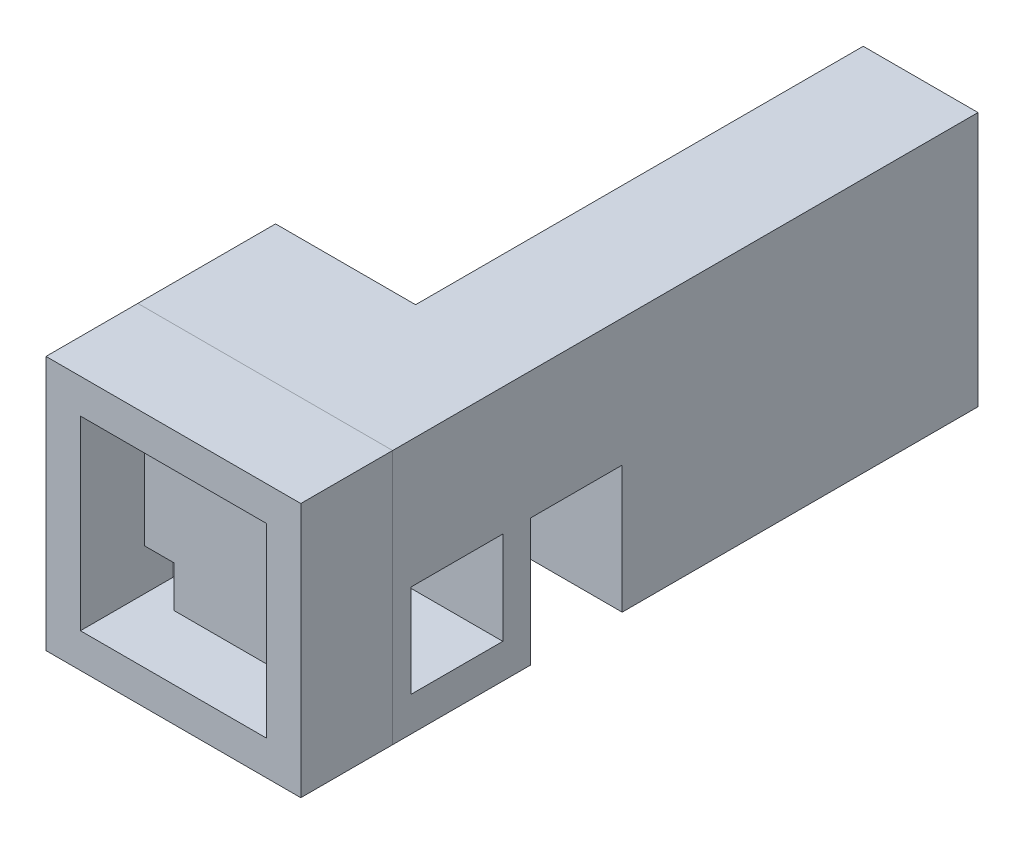
ISO-10303-21;
HEADER;
FILE_DESCRIPTION(('STEP AP214'),'2;1');
FILE_NAME('part.step','',(''),(''),'','','');
FILE_SCHEMA(('AUTOMOTIVE_DESIGN { 1 0 10303 214 1 1 1 1 }'));
ENDSEC;
DATA;
#1=APPLICATION_CONTEXT('core data for automotive mechanical design processes');
#2=APPLICATION_PROTOCOL_DEFINITION('international standard','automotive_design',2000,#1);
#3=PRODUCT_CONTEXT('',#1,'mechanical');
#4=PRODUCT('Part','Part','',(#3));
#5=PRODUCT_RELATED_PRODUCT_CATEGORY('part','',(#4));
#6=PRODUCT_DEFINITION_FORMATION('','',#4);
#7=PRODUCT_DEFINITION_CONTEXT('part definition',#1,'design');
#8=PRODUCT_DEFINITION('design','',#6,#7);
#9=PRODUCT_DEFINITION_SHAPE('','',#8);
#10=(LENGTH_UNIT() NAMED_UNIT(*) SI_UNIT(.MILLI.,.METRE.));
#11=(NAMED_UNIT(*) PLANE_ANGLE_UNIT() SI_UNIT($,.RADIAN.));
#12=(NAMED_UNIT(*) SI_UNIT($,.STERADIAN.) SOLID_ANGLE_UNIT());
#13=UNCERTAINTY_MEASURE_WITH_UNIT(LENGTH_MEASURE(1.E-05),#10,'distance_accuracy_value','');
#14=(GEOMETRIC_REPRESENTATION_CONTEXT(3) GLOBAL_UNCERTAINTY_ASSIGNED_CONTEXT((#13)) GLOBAL_UNIT_ASSIGNED_CONTEXT((#10,
#11,#12)) REPRESENTATION_CONTEXT('',''));
#15=CARTESIAN_POINT('',(0.,0.,0.));
#16=DIRECTION('',(0.,0.,1.));
#17=DIRECTION('',(1.,0.,0.));
#18=AXIS2_PLACEMENT_3D('',#15,#16,#17);
#19=CARTESIAN_POINT('',(8.1,8.1,25.5));
#20=DIRECTION('',(0.,0.,-1.));
#21=DIRECTION('',(-1.,0.,0.));
#22=AXIS2_PLACEMENT_3D('',#19,#20,#21);
#23=PLANE('',#22);
#24=DIRECTION('',(1.,0.,0.));
#25=VECTOR('',#24,1.);
#26=CARTESIAN_POINT('',(0.,0.,25.5));
#27=LINE('',#26,#25);
#28=CARTESIAN_POINT('',(0.,0.,25.5));
#29=VERTEX_POINT('',#28);
#30=CARTESIAN_POINT('',(1.275,0.,25.5));
#31=VERTEX_POINT('',#30);
#32=EDGE_CURVE('E225',#29,#31,#27,.T.);
#33=ORIENTED_EDGE('',*,*,#32,.T.);
#34=DIRECTION('',(0.,1.,0.));
#35=VECTOR('',#34,1.);
#36=CARTESIAN_POINT('',(1.275,0.,25.5));
#37=LINE('',#36,#35);
#38=CARTESIAN_POINT('',(1.275,1.8,25.5));
#39=VERTEX_POINT('',#38);
#40=EDGE_CURVE('E212',#31,#39,#37,.T.);
#41=ORIENTED_EDGE('',*,*,#40,.T.);
#42=DIRECTION('',(-1.,0.,0.));
#43=VECTOR('',#42,1.);
#44=CARTESIAN_POINT('',(0.,1.8,25.5));
#45=LINE('',#44,#43);
#46=CARTESIAN_POINT('',(0.,1.8,25.5));
#47=VERTEX_POINT('',#46);
#48=EDGE_CURVE('E240',#39,#47,#45,.T.);
#49=ORIENTED_EDGE('',*,*,#48,.T.);
#50=DIRECTION('',(0.,-1.,0.));
#51=VECTOR('',#50,1.);
#52=CARTESIAN_POINT('',(0.,0.,25.5));
#53=LINE('',#52,#51);
#54=EDGE_CURVE('E230',#47,#29,#53,.T.);
#55=ORIENTED_EDGE('',*,*,#54,.T.);
#56=EDGE_LOOP('',(#33,#41,#49,#55));
#57=FACE_BOUND('',#56,.T.);
#58=DIRECTION('',(-1.,0.,0.));
#59=VECTOR('',#58,1.);
#60=CARTESIAN_POINT('',(8.1,1.8,25.5));
#61=LINE('',#60,#59);
#62=CARTESIAN_POINT('',(8.1,1.8,25.5));
#63=VERTEX_POINT('',#62);
#64=CARTESIAN_POINT('',(6.825,1.8,25.5));
#65=VERTEX_POINT('',#64);
#66=EDGE_CURVE('E247',#63,#65,#61,.T.);
#67=ORIENTED_EDGE('',*,*,#66,.T.);
#68=DIRECTION('',(0.,-1.,0.));
#69=VECTOR('',#68,1.);
#70=CARTESIAN_POINT('',(6.825,0.,25.5));
#71=LINE('',#70,#69);
#72=CARTESIAN_POINT('',(6.825,0.,25.5));
#73=VERTEX_POINT('',#72);
#74=EDGE_CURVE('E261',#65,#73,#71,.T.);
#75=ORIENTED_EDGE('',*,*,#74,.T.);
#76=DIRECTION('',(1.,0.,0.));
#77=VECTOR('',#76,1.);
#78=CARTESIAN_POINT('',(8.1,0.,25.5));
#79=LINE('',#78,#77);
#80=CARTESIAN_POINT('',(8.1,0.,25.5));
#81=VERTEX_POINT('',#80);
#82=EDGE_CURVE('E257',#73,#81,#79,.T.);
#83=ORIENTED_EDGE('',*,*,#82,.T.);
#84=DIRECTION('',(0.,1.,0.));
#85=VECTOR('',#84,1.);
#86=CARTESIAN_POINT('',(8.1,0.,25.5));
#87=LINE('',#86,#85);
#88=EDGE_CURVE('E253',#81,#63,#87,.T.);
#89=ORIENTED_EDGE('',*,*,#88,.T.);
#90=EDGE_LOOP('',(#67,#75,#83,#89));
#91=FACE_BOUND('',#90,.T.);
#92=DIRECTION('',(1.,0.,0.));
#93=VECTOR('',#92,1.);
#94=CARTESIAN_POINT('',(0.,6.3,25.5));
#95=LINE('',#94,#93);
#96=CARTESIAN_POINT('',(0.,6.3,25.5));
#97=VERTEX_POINT('',#96);
#98=CARTESIAN_POINT('',(1.275,6.3,25.5));
#99=VERTEX_POINT('',#98);
#100=EDGE_CURVE('E270',#97,#99,#95,.T.);
#101=ORIENTED_EDGE('',*,*,#100,.T.);
#102=DIRECTION('',(0.,1.,0.));
#103=VECTOR('',#102,1.);
#104=CARTESIAN_POINT('',(1.275,8.1,25.5));
#105=LINE('',#104,#103);
#106=CARTESIAN_POINT('',(1.275,8.1,25.5));
#107=VERTEX_POINT('',#106);
#108=EDGE_CURVE('E284',#99,#107,#105,.T.);
#109=ORIENTED_EDGE('',*,*,#108,.T.);
#110=DIRECTION('',(-1.,0.,0.));
#111=VECTOR('',#110,1.);
#112=CARTESIAN_POINT('',(0.,8.1,25.5));
#113=LINE('',#112,#111);
#114=CARTESIAN_POINT('',(0.,8.1,25.5));
#115=VERTEX_POINT('',#114);
#116=EDGE_CURVE('E280',#107,#115,#113,.T.);
#117=ORIENTED_EDGE('',*,*,#116,.T.);
#118=DIRECTION('',(0.,-1.,0.));
#119=VECTOR('',#118,1.);
#120=CARTESIAN_POINT('',(0.,8.1,25.5));
#121=LINE('',#120,#119);
#122=EDGE_CURVE('E277',#115,#97,#121,.T.);
#123=ORIENTED_EDGE('',*,*,#122,.T.);
#124=EDGE_LOOP('',(#101,#109,#117,#123));
#125=FACE_BOUND('',#124,.T.);
#126=DIRECTION('',(1.,0.,0.));
#127=VECTOR('',#126,1.);
#128=CARTESIAN_POINT('',(8.1,6.3,25.5));
#129=LINE('',#128,#127);
#130=CARTESIAN_POINT('',(6.825,6.3,25.5));
#131=VERTEX_POINT('',#130);
#132=CARTESIAN_POINT('',(8.1,6.3,25.5));
#133=VERTEX_POINT('',#132);
#134=EDGE_CURVE('E294',#131,#133,#129,.T.);
#135=ORIENTED_EDGE('',*,*,#134,.T.);
#136=DIRECTION('',(0.,1.,0.));
#137=VECTOR('',#136,1.);
#138=CARTESIAN_POINT('',(8.1,8.1,25.5));
#139=LINE('',#138,#137);
#140=CARTESIAN_POINT('',(8.1,8.1,25.5));
#141=VERTEX_POINT('',#140);
#142=EDGE_CURVE('E307',#133,#141,#139,.T.);
#143=ORIENTED_EDGE('',*,*,#142,.T.);
#144=DIRECTION('',(-1.,0.,0.));
#145=VECTOR('',#144,1.);
#146=CARTESIAN_POINT('',(8.1,8.1,25.5));
#147=LINE('',#146,#145);
#148=CARTESIAN_POINT('',(6.825,8.1,25.5));
#149=VERTEX_POINT('',#148);
#150=EDGE_CURVE('E304',#141,#149,#147,.T.);
#151=ORIENTED_EDGE('',*,*,#150,.T.);
#152=DIRECTION('',(0.,-1.,0.));
#153=VECTOR('',#152,1.);
#154=CARTESIAN_POINT('',(6.825,8.1,25.5));
#155=LINE('',#154,#153);
#156=EDGE_CURVE('E300',#149,#131,#155,.T.);
#157=ORIENTED_EDGE('',*,*,#156,.T.);
#158=EDGE_LOOP('',(#135,#143,#151,#157));
#159=FACE_BOUND('',#158,.T.);
#160=DIRECTION('',(0.,1.,0.));
#161=VECTOR('',#160,1.);
#162=CARTESIAN_POINT('',(9.6,0.,25.5));
#163=LINE('',#162,#161);
#164=CARTESIAN_POINT('',(9.6,-1.5,25.5));
#165=VERTEX_POINT('',#164);
#166=CARTESIAN_POINT('',(9.6,9.60000000000001,25.5));
#167=VERTEX_POINT('',#166);
#168=EDGE_CURVE('E351',#165,#167,#163,.T.);
#169=ORIENTED_EDGE('',*,*,#168,.F.);
#170=DIRECTION('',(-1.,0.,0.));
#171=VECTOR('',#170,1.);
#172=CARTESIAN_POINT('',(0.,-1.5,25.5));
#173=LINE('',#172,#171);
#174=CARTESIAN_POINT('',(-1.5,-1.5,25.5));
#175=VERTEX_POINT('',#174);
#176=EDGE_CURVE('E354',#165,#175,#173,.T.);
#177=ORIENTED_EDGE('',*,*,#176,.T.);
#178=DIRECTION('',(0.,1.,0.));
#179=VECTOR('',#178,1.);
#180=CARTESIAN_POINT('',(-1.5,0.,25.5));
#181=LINE('',#180,#179);
#182=CARTESIAN_POINT('',(-1.5,9.6,25.5));
#183=VERTEX_POINT('',#182);
#184=EDGE_CURVE('E238',#175,#183,#181,.T.);
#185=ORIENTED_EDGE('',*,*,#184,.T.);
#186=DIRECTION('',(-1.,0.,0.));
#187=VECTOR('',#186,1.);
#188=CARTESIAN_POINT('',(0.,9.6,25.5));
#189=LINE('',#188,#187);
#190=EDGE_CURVE('E318',#167,#183,#189,.T.);
#191=ORIENTED_EDGE('',*,*,#190,.F.);
#192=EDGE_LOOP('',(#169,#177,#185,#191));
#193=FACE_BOUND('',#192,.T.);
#194=ADVANCED_FACE('F73',(#57,#91,#125,#159,#193),#23,.T.);
#195=CARTESIAN_POINT('',(0.,-1.5,19.5));
#196=DIRECTION('',(0.,1.,0.));
#197=DIRECTION('',(0.,0.,1.));
#198=AXIS2_PLACEMENT_3D('',#195,#196,#197);
#199=PLANE('',#198);
#200=ORIENTED_EDGE('',*,*,#176,.F.);
#201=DIRECTION('',(0.,0.,-1.));
#202=VECTOR('',#201,1.);
#203=CARTESIAN_POINT('',(9.6,-1.5,19.5));
#204=LINE('',#203,#202);
#205=CARTESIAN_POINT('',(9.6,-1.5,29.5));
#206=VERTEX_POINT('',#205);
#207=EDGE_CURVE('E317',#206,#165,#204,.T.);
#208=ORIENTED_EDGE('',*,*,#207,.F.);
#209=DIRECTION('',(1.,0.,0.));
#210=VECTOR('',#209,1.);
#211=CARTESIAN_POINT('',(0.,-1.5,29.5));
#212=LINE('',#211,#210);
#213=CARTESIAN_POINT('',(-1.5,-1.5,29.5));
#214=VERTEX_POINT('',#213);
#215=EDGE_CURVE('E326',#214,#206,#212,.T.);
#216=ORIENTED_EDGE('',*,*,#215,.F.);
#217=DIRECTION('',(0.,0.,-1.));
#218=VECTOR('',#217,1.);
#219=CARTESIAN_POINT('',(-1.5,-1.5,20.7));
#220=LINE('',#219,#218);
#221=EDGE_CURVE('E329',#214,#175,#220,.T.);
#222=ORIENTED_EDGE('',*,*,#221,.T.);
#223=EDGE_LOOP('',(#200,#208,#216,#222));
#224=FACE_BOUND('',#223,.T.);
#225=ADVANCED_FACE('F428',(#224),#199,.F.);
#226=CARTESIAN_POINT('',(9.6,0.,19.5));
#227=DIRECTION('',(1.,0.,0.));
#228=DIRECTION('',(0.,1.,0.));
#229=AXIS2_PLACEMENT_3D('',#226,#227,#228);
#230=PLANE('',#229);
#231=ORIENTED_EDGE('',*,*,#207,.T.);
#232=ORIENTED_EDGE('',*,*,#168,.T.);
#233=DIRECTION('',(0.,0.,-1.));
#234=VECTOR('',#233,1.);
#235=CARTESIAN_POINT('',(9.6,9.60000000000001,19.5));
#236=LINE('',#235,#234);
#237=CARTESIAN_POINT('',(9.6,9.60000000000001,29.5));
#238=VERTEX_POINT('',#237);
#239=EDGE_CURVE('E361',#238,#167,#236,.T.);
#240=ORIENTED_EDGE('',*,*,#239,.F.);
#241=DIRECTION('',(0.,1.,0.));
#242=VECTOR('',#241,1.);
#243=CARTESIAN_POINT('',(9.6,0.,29.5));
#244=LINE('',#243,#242);
#245=EDGE_CURVE('E322',#206,#238,#244,.T.);
#246=ORIENTED_EDGE('',*,*,#245,.F.);
#247=EDGE_LOOP('',(#231,#232,#240,#246));
#248=FACE_BOUND('',#247,.T.);
#249=ADVANCED_FACE('F430',(#248),#230,.T.);
#250=CARTESIAN_POINT('',(0.,9.6,19.5));
#251=DIRECTION('',(0.,1.,0.));
#252=DIRECTION('',(-1.,0.,0.));
#253=AXIS2_PLACEMENT_3D('',#250,#251,#252);
#254=PLANE('',#253);
#255=ORIENTED_EDGE('',*,*,#239,.T.);
#256=ORIENTED_EDGE('',*,*,#190,.T.);
#257=DIRECTION('',(0.,0.,-1.));
#258=VECTOR('',#257,1.);
#259=CARTESIAN_POINT('',(-1.5,9.6,20.7));
#260=LINE('',#259,#258);
#261=CARTESIAN_POINT('',(-1.5,9.6,29.5));
#262=VERTEX_POINT('',#261);
#263=EDGE_CURVE('E364',#262,#183,#260,.T.);
#264=ORIENTED_EDGE('',*,*,#263,.F.);
#265=DIRECTION('',(1.,0.,0.));
#266=VECTOR('',#265,1.);
#267=CARTESIAN_POINT('',(0.,9.6,29.5));
#268=LINE('',#267,#266);
#269=EDGE_CURVE('E335',#262,#238,#268,.T.);
#270=ORIENTED_EDGE('',*,*,#269,.T.);
#271=EDGE_LOOP('',(#255,#256,#264,#270));
#272=FACE_BOUND('',#271,.T.);
#273=ADVANCED_FACE('F437',(#272),#254,.T.);
#274=CARTESIAN_POINT('',(-1.5,0.,20.7));
#275=DIRECTION('',(1.,0.,0.));
#276=DIRECTION('',(0.,1.,0.));
#277=AXIS2_PLACEMENT_3D('',#274,#275,#276);
#278=PLANE('',#277);
#279=ORIENTED_EDGE('',*,*,#184,.F.);
#280=ORIENTED_EDGE('',*,*,#221,.F.);
#281=DIRECTION('',(0.,-1.,0.));
#282=VECTOR('',#281,1.);
#283=CARTESIAN_POINT('',(-1.5,0.,29.5));
#284=LINE('',#283,#282);
#285=EDGE_CURVE('E339',#262,#214,#284,.T.);
#286=ORIENTED_EDGE('',*,*,#285,.F.);
#287=ORIENTED_EDGE('',*,*,#263,.T.);
#288=EDGE_LOOP('',(#279,#280,#286,#287));
#289=FACE_BOUND('',#288,.T.);
#290=ADVANCED_FACE('F444',(#289),#278,.F.);
#291=CARTESIAN_POINT('',(0.,8.1,55.1977705423414));
#292=DIRECTION('',(0.,-1.,0.));
#293=DIRECTION('',(0.,0.,-1.));
#294=AXIS2_PLACEMENT_3D('',#291,#292,#293);
#295=PLANE('',#294);
#296=DIRECTION('',(-1.,0.,0.));
#297=VECTOR('',#296,1.);
#298=CARTESIAN_POINT('',(0.,8.1,26.7));
#299=LINE('',#298,#297);
#300=CARTESIAN_POINT('',(6.825,8.1,26.7));
#301=VERTEX_POINT('',#300);
#302=CARTESIAN_POINT('',(1.275,8.1,26.7));
#303=VERTEX_POINT('',#302);
#304=EDGE_CURVE('E338',#301,#303,#299,.T.);
#305=ORIENTED_EDGE('',*,*,#304,.F.);
#306=DIRECTION('',(0.,0.,1.));
#307=VECTOR('',#306,1.);
#308=CARTESIAN_POINT('',(6.825,8.1,23.2941838245221));
#309=LINE('',#308,#307);
#310=EDGE_CURVE('E303',#149,#301,#309,.T.);
#311=ORIENTED_EDGE('',*,*,#310,.F.);
#312=ORIENTED_EDGE('',*,*,#150,.F.);
#313=DIRECTION('',(0.,0.,-1.));
#314=VECTOR('',#313,1.);
#315=CARTESIAN_POINT('',(8.1,8.1,55.1977705423414));
#316=LINE('',#315,#314);
#317=CARTESIAN_POINT('',(8.1,8.1,29.5));
#318=VERTEX_POINT('',#317);
#319=EDGE_CURVE('E342',#318,#141,#316,.T.);
#320=ORIENTED_EDGE('',*,*,#319,.F.);
#321=DIRECTION('',(-1.,0.,0.));
#322=VECTOR('',#321,1.);
#323=CARTESIAN_POINT('',(0.,8.1,29.5));
#324=LINE('',#323,#322);
#325=CARTESIAN_POINT('',(0.,8.1,29.5));
#326=VERTEX_POINT('',#325);
#327=EDGE_CURVE('E333',#318,#326,#324,.T.);
#328=ORIENTED_EDGE('',*,*,#327,.T.);
#329=DIRECTION('',(0.,0.,-1.));
#330=VECTOR('',#329,1.);
#331=CARTESIAN_POINT('',(0.,8.1,55.1977705423414));
#332=LINE('',#331,#330);
#333=EDGE_CURVE('E77',#326,#115,#332,.T.);
#334=ORIENTED_EDGE('',*,*,#333,.T.);
#335=ORIENTED_EDGE('',*,*,#116,.F.);
#336=DIRECTION('',(0.,0.,1.));
#337=VECTOR('',#336,1.);
#338=CARTESIAN_POINT('',(1.275,8.1,23.2941838245221));
#339=LINE('',#338,#337);
#340=EDGE_CURVE('E283',#107,#303,#339,.T.);
#341=ORIENTED_EDGE('',*,*,#340,.T.);
#342=EDGE_LOOP('',(#305,#311,#312,#320,#328,#334,#335,#341));
#343=FACE_BOUND('',#342,.T.);
#344=ADVANCED_FACE('F406',(#343),#295,.T.);
#345=CARTESIAN_POINT('',(0.,0.,55.1977705423414));
#346=DIRECTION('',(1.,0.,0.));
#347=DIRECTION('',(0.,1.,0.));
#348=AXIS2_PLACEMENT_3D('',#345,#346,#347);
#349=PLANE('',#348);
#350=DIRECTION('',(0.,-1.,0.));
#351=VECTOR('',#350,1.);
#352=CARTESIAN_POINT('',(0.,0.,26.7));
#353=LINE('',#352,#351);
#354=CARTESIAN_POINT('',(0.,6.3,26.7));
#355=VERTEX_POINT('',#354);
#356=CARTESIAN_POINT('',(0.,1.8,26.7));
#357=VERTEX_POINT('',#356);
#358=EDGE_CURVE('E82',#355,#357,#353,.T.);
#359=ORIENTED_EDGE('',*,*,#358,.F.);
#360=DIRECTION('',(0.,0.,1.));
#361=VECTOR('',#360,1.);
#362=CARTESIAN_POINT('',(0.,6.3,23.2941838245221));
#363=LINE('',#362,#361);
#364=EDGE_CURVE('E249',#97,#355,#363,.T.);
#365=ORIENTED_EDGE('',*,*,#364,.F.);
#366=ORIENTED_EDGE('',*,*,#122,.F.);
#367=ORIENTED_EDGE('',*,*,#333,.F.);
#368=DIRECTION('',(0.,-1.,0.));
#369=VECTOR('',#368,1.);
#370=CARTESIAN_POINT('',(0.,0.,29.5));
#371=LINE('',#370,#369);
#372=CARTESIAN_POINT('',(0.,0.,29.5));
#373=VERTEX_POINT('',#372);
#374=EDGE_CURVE('E330',#326,#373,#371,.T.);
#375=ORIENTED_EDGE('',*,*,#374,.T.);
#376=DIRECTION('',(0.,0.,-1.));
#377=VECTOR('',#376,1.);
#378=CARTESIAN_POINT('',(0.,0.,55.1977705423414));
#379=LINE('',#378,#377);
#380=EDGE_CURVE('E332',#373,#29,#379,.T.);
#381=ORIENTED_EDGE('',*,*,#380,.T.);
#382=ORIENTED_EDGE('',*,*,#54,.F.);
#383=DIRECTION('',(0.,0.,1.));
#384=VECTOR('',#383,1.);
#385=CARTESIAN_POINT('',(0.,1.8,23.2941838245221));
#386=LINE('',#385,#384);
#387=EDGE_CURVE('E239',#47,#357,#386,.T.);
#388=ORIENTED_EDGE('',*,*,#387,.T.);
#389=EDGE_LOOP('',(#359,#365,#366,#367,#375,#381,#382,#388));
#390=FACE_BOUND('',#389,.T.);
#391=ADVANCED_FACE('F75',(#390),#349,.T.);
#392=CARTESIAN_POINT('',(0.,0.,55.1977705423414));
#393=DIRECTION('',(0.,-1.,0.));
#394=DIRECTION('',(0.,0.,-1.));
#395=AXIS2_PLACEMENT_3D('',#392,#393,#394);
#396=PLANE('',#395);
#397=DIRECTION('',(0.,0.,-1.));
#398=VECTOR('',#397,1.);
#399=CARTESIAN_POINT('',(8.1,0.,55.1977705423414));
#400=LINE('',#399,#398);
#401=CARTESIAN_POINT('',(8.1,0.,29.5));
#402=VERTEX_POINT('',#401);
#403=EDGE_CURVE('E368',#402,#81,#400,.T.);
#404=ORIENTED_EDGE('',*,*,#403,.T.);
#405=ORIENTED_EDGE('',*,*,#82,.F.);
#406=DIRECTION('',(0.,0.,1.));
#407=VECTOR('',#406,1.);
#408=CARTESIAN_POINT('',(6.825,0.,23.2941838245221));
#409=LINE('',#408,#407);
#410=CARTESIAN_POINT('',(6.825,0.,26.7));
#411=VERTEX_POINT('',#410);
#412=EDGE_CURVE('E260',#73,#411,#409,.T.);
#413=ORIENTED_EDGE('',*,*,#412,.T.);
#414=DIRECTION('',(-1.,0.,0.));
#415=VECTOR('',#414,1.);
#416=CARTESIAN_POINT('',(0.,0.,26.7));
#417=LINE('',#416,#415);
#418=CARTESIAN_POINT('',(1.275,0.,26.7));
#419=VERTEX_POINT('',#418);
#420=EDGE_CURVE('E14',#411,#419,#417,.T.);
#421=ORIENTED_EDGE('',*,*,#420,.T.);
#422=DIRECTION('',(0.,0.,1.));
#423=VECTOR('',#422,1.);
#424=CARTESIAN_POINT('',(1.275,0.,23.2941838245221));
#425=LINE('',#424,#423);
#426=EDGE_CURVE('E215',#31,#419,#425,.T.);
#427=ORIENTED_EDGE('',*,*,#426,.F.);
#428=ORIENTED_EDGE('',*,*,#32,.F.);
#429=ORIENTED_EDGE('',*,*,#380,.F.);
#430=DIRECTION('',(-1.,0.,0.));
#431=VECTOR('',#430,1.);
#432=CARTESIAN_POINT('',(0.,0.,29.5));
#433=LINE('',#432,#431);
#434=EDGE_CURVE('E323',#402,#373,#433,.T.);
#435=ORIENTED_EDGE('',*,*,#434,.F.);
#436=EDGE_LOOP('',(#404,#405,#413,#421,#427,#428,#429,#435));
#437=FACE_BOUND('',#436,.T.);
#438=ADVANCED_FACE('F223',(#437),#396,.F.);
#439=CARTESIAN_POINT('',(8.1,0.,55.1977705423414));
#440=DIRECTION('',(1.,0.,0.));
#441=DIRECTION('',(0.,1.,0.));
#442=AXIS2_PLACEMENT_3D('',#439,#440,#441);
#443=PLANE('',#442);
#444=ORIENTED_EDGE('',*,*,#319,.T.);
#445=ORIENTED_EDGE('',*,*,#142,.F.);
#446=DIRECTION('',(0.,0.,1.));
#447=VECTOR('',#446,1.);
#448=CARTESIAN_POINT('',(8.1,6.3,23.2941838245221));
#449=LINE('',#448,#447);
#450=CARTESIAN_POINT('',(8.1,6.3,26.7));
#451=VERTEX_POINT('',#450);
#452=EDGE_CURVE('E299',#133,#451,#449,.T.);
#453=ORIENTED_EDGE('',*,*,#452,.T.);
#454=DIRECTION('',(0.,-1.,0.));
#455=VECTOR('',#454,1.);
#456=CARTESIAN_POINT('',(8.1,0.,26.7));
#457=LINE('',#456,#455);
#458=CARTESIAN_POINT('',(8.1,1.8,26.7));
#459=VERTEX_POINT('',#458);
#460=EDGE_CURVE('E314',#451,#459,#457,.T.);
#461=ORIENTED_EDGE('',*,*,#460,.T.);
#462=DIRECTION('',(0.,0.,1.));
#463=VECTOR('',#462,1.);
#464=CARTESIAN_POINT('',(8.1,1.8,23.2941838245221));
#465=LINE('',#464,#463);
#466=EDGE_CURVE('E256',#63,#459,#465,.T.);
#467=ORIENTED_EDGE('',*,*,#466,.F.);
#468=ORIENTED_EDGE('',*,*,#88,.F.);
#469=ORIENTED_EDGE('',*,*,#403,.F.);
#470=DIRECTION('',(0.,-1.,0.));
#471=VECTOR('',#470,1.);
#472=CARTESIAN_POINT('',(8.1,0.,29.5));
#473=LINE('',#472,#471);
#474=EDGE_CURVE('E319',#318,#402,#473,.T.);
#475=ORIENTED_EDGE('',*,*,#474,.F.);
#476=EDGE_LOOP('',(#444,#445,#453,#461,#467,#468,#469,#475));
#477=FACE_BOUND('',#476,.T.);
#478=ADVANCED_FACE('F380',(#477),#443,.F.);
#479=CARTESIAN_POINT('',(0.,0.,29.5));
#480=DIRECTION('',(0.,0.,1.));
#481=DIRECTION('',(1.,0.,0.));
#482=AXIS2_PLACEMENT_3D('',#479,#480,#481);
#483=PLANE('',#482);
#484=ORIENTED_EDGE('',*,*,#269,.F.);
#485=ORIENTED_EDGE('',*,*,#285,.T.);
#486=ORIENTED_EDGE('',*,*,#215,.T.);
#487=ORIENTED_EDGE('',*,*,#245,.T.);
#488=EDGE_LOOP('',(#484,#485,#486,#487));
#489=FACE_BOUND('',#488,.T.);
#490=ORIENTED_EDGE('',*,*,#327,.F.);
#491=ORIENTED_EDGE('',*,*,#474,.T.);
#492=ORIENTED_EDGE('',*,*,#434,.T.);
#493=ORIENTED_EDGE('',*,*,#374,.F.);
#494=EDGE_LOOP('',(#490,#491,#492,#493));
#495=FACE_BOUND('',#494,.T.);
#496=ADVANCED_FACE('F377',(#489,#495),#483,.T.);
#497=CARTESIAN_POINT('',(0.,0.,26.7));
#498=DIRECTION('',(0.,0.,1.));
#499=DIRECTION('',(1.,0.,0.));
#500=AXIS2_PLACEMENT_3D('',#497,#498,#499);
#501=PLANE('',#500);
#502=DIRECTION('',(0.,1.,0.));
#503=VECTOR('',#502,1.);
#504=CARTESIAN_POINT('',(1.275,0.,26.7));
#505=LINE('',#504,#503);
#506=CARTESIAN_POINT('',(1.275,1.8,26.7));
#507=VERTEX_POINT('',#506);
#508=EDGE_CURVE('E90',#419,#507,#505,.T.);
#509=ORIENTED_EDGE('',*,*,#508,.F.);
#510=ORIENTED_EDGE('',*,*,#420,.F.);
#511=DIRECTION('',(0.,-1.,0.));
#512=VECTOR('',#511,1.);
#513=CARTESIAN_POINT('',(6.825,0.,26.7));
#514=LINE('',#513,#512);
#515=CARTESIAN_POINT('',(6.825,1.8,26.7));
#516=VERTEX_POINT('',#515);
#517=EDGE_CURVE('E244',#516,#411,#514,.T.);
#518=ORIENTED_EDGE('',*,*,#517,.F.);
#519=DIRECTION('',(-1.,0.,0.));
#520=VECTOR('',#519,1.);
#521=CARTESIAN_POINT('',(8.1,1.8,26.7));
#522=LINE('',#521,#520);
#523=EDGE_CURVE('E98',#459,#516,#522,.T.);
#524=ORIENTED_EDGE('',*,*,#523,.F.);
#525=ORIENTED_EDGE('',*,*,#460,.F.);
#526=DIRECTION('',(1.,0.,0.));
#527=VECTOR('',#526,1.);
#528=CARTESIAN_POINT('',(8.1,6.3,26.7));
#529=LINE('',#528,#527);
#530=CARTESIAN_POINT('',(6.825,6.3,26.7));
#531=VERTEX_POINT('',#530);
#532=EDGE_CURVE('E291',#531,#451,#529,.T.);
#533=ORIENTED_EDGE('',*,*,#532,.F.);
#534=DIRECTION('',(0.,-1.,0.));
#535=VECTOR('',#534,1.);
#536=CARTESIAN_POINT('',(6.825,8.1,26.7));
#537=LINE('',#536,#535);
#538=EDGE_CURVE('E295',#301,#531,#537,.T.);
#539=ORIENTED_EDGE('',*,*,#538,.F.);
#540=ORIENTED_EDGE('',*,*,#304,.T.);
#541=DIRECTION('',(0.,1.,0.));
#542=VECTOR('',#541,1.);
#543=CARTESIAN_POINT('',(1.275,8.1,26.7));
#544=LINE('',#543,#542);
#545=CARTESIAN_POINT('',(1.275,6.3,26.7));
#546=VERTEX_POINT('',#545);
#547=EDGE_CURVE('E267',#546,#303,#544,.T.);
#548=ORIENTED_EDGE('',*,*,#547,.F.);
#549=DIRECTION('',(1.,0.,0.));
#550=VECTOR('',#549,1.);
#551=CARTESIAN_POINT('',(0.,6.3,26.7));
#552=LINE('',#551,#550);
#553=EDGE_CURVE('E271',#355,#546,#552,.T.);
#554=ORIENTED_EDGE('',*,*,#553,.F.);
#555=ORIENTED_EDGE('',*,*,#358,.T.);
#556=DIRECTION('',(-1.,0.,0.));
#557=VECTOR('',#556,1.);
#558=CARTESIAN_POINT('',(0.,1.8,26.7));
#559=LINE('',#558,#557);
#560=EDGE_CURVE('E231',#507,#357,#559,.T.);
#561=ORIENTED_EDGE('',*,*,#560,.F.);
#562=EDGE_LOOP('',(#509,#510,#518,#524,#525,#533,#539,#540,#548,#554,#555,#561));
#563=FACE_BOUND('',#562,.T.);
#564=ADVANCED_FACE('F391',(#563),#501,.T.);
#565=CARTESIAN_POINT('',(8.1,6.3,23.2941838245221));
#566=DIRECTION('',(0.,-1.,0.));
#567=DIRECTION('',(0.,0.,-1.));
#568=AXIS2_PLACEMENT_3D('',#565,#566,#567);
#569=PLANE('',#568);
#570=DIRECTION('',(0.,0.,1.));
#571=VECTOR('',#570,1.);
#572=CARTESIAN_POINT('',(6.825,6.3,23.2941838245221));
#573=LINE('',#572,#571);
#574=EDGE_CURVE('E273',#131,#531,#573,.T.);
#575=ORIENTED_EDGE('',*,*,#574,.T.);
#576=ORIENTED_EDGE('',*,*,#532,.T.);
#577=ORIENTED_EDGE('',*,*,#452,.F.);
#578=ORIENTED_EDGE('',*,*,#134,.F.);
#579=EDGE_LOOP('',(#575,#576,#577,#578));
#580=FACE_BOUND('',#579,.T.);
#581=ADVANCED_FACE('F418',(#580),#569,.F.);
#582=CARTESIAN_POINT('',(6.825,8.1,23.2941838245221));
#583=DIRECTION('',(-1.,0.,0.));
#584=DIRECTION('',(0.,0.,1.));
#585=AXIS2_PLACEMENT_3D('',#582,#583,#584);
#586=PLANE('',#585);
#587=ORIENTED_EDGE('',*,*,#310,.T.);
#588=ORIENTED_EDGE('',*,*,#538,.T.);
#589=ORIENTED_EDGE('',*,*,#574,.F.);
#590=ORIENTED_EDGE('',*,*,#156,.F.);
#591=EDGE_LOOP('',(#587,#588,#589,#590));
#592=FACE_BOUND('',#591,.T.);
#593=ADVANCED_FACE('F419',(#592),#586,.F.);
#594=CARTESIAN_POINT('',(0.,6.3,23.2941838245221));
#595=DIRECTION('',(0.,-1.,0.));
#596=DIRECTION('',(0.,0.,-1.));
#597=AXIS2_PLACEMENT_3D('',#594,#595,#596);
#598=PLANE('',#597);
#599=ORIENTED_EDGE('',*,*,#364,.T.);
#600=ORIENTED_EDGE('',*,*,#553,.T.);
#601=DIRECTION('',(0.,0.,1.));
#602=VECTOR('',#601,1.);
#603=CARTESIAN_POINT('',(1.275,6.3,23.2941838245221));
#604=LINE('',#603,#602);
#605=EDGE_CURVE('E276',#99,#546,#604,.T.);
#606=ORIENTED_EDGE('',*,*,#605,.F.);
#607=ORIENTED_EDGE('',*,*,#100,.F.);
#608=EDGE_LOOP('',(#599,#600,#606,#607));
#609=FACE_BOUND('',#608,.T.);
#610=ADVANCED_FACE('F401',(#609),#598,.F.);
#611=CARTESIAN_POINT('',(1.275,8.1,23.2941838245221));
#612=DIRECTION('',(1.,0.,0.));
#613=DIRECTION('',(0.,1.,0.));
#614=AXIS2_PLACEMENT_3D('',#611,#612,#613);
#615=PLANE('',#614);
#616=ORIENTED_EDGE('',*,*,#605,.T.);
#617=ORIENTED_EDGE('',*,*,#547,.T.);
#618=ORIENTED_EDGE('',*,*,#340,.F.);
#619=ORIENTED_EDGE('',*,*,#108,.F.);
#620=EDGE_LOOP('',(#616,#617,#618,#619));
#621=FACE_BOUND('',#620,.T.);
#622=ADVANCED_FACE('F408',(#621),#615,.F.);
#623=CARTESIAN_POINT('',(8.1,1.8,23.2941838245221));
#624=DIRECTION('',(0.,1.,0.));
#625=DIRECTION('',(-1.,0.,0.));
#626=AXIS2_PLACEMENT_3D('',#623,#624,#625);
#627=PLANE('',#626);
#628=ORIENTED_EDGE('',*,*,#466,.T.);
#629=ORIENTED_EDGE('',*,*,#523,.T.);
#630=DIRECTION('',(0.,0.,1.));
#631=VECTOR('',#630,1.);
#632=CARTESIAN_POINT('',(6.825,1.8,23.2941838245221));
#633=LINE('',#632,#631);
#634=EDGE_CURVE('E252',#65,#516,#633,.T.);
#635=ORIENTED_EDGE('',*,*,#634,.F.);
#636=ORIENTED_EDGE('',*,*,#66,.F.);
#637=EDGE_LOOP('',(#628,#629,#635,#636));
#638=FACE_BOUND('',#637,.T.);
#639=ADVANCED_FACE('F389',(#638),#627,.F.);
#640=CARTESIAN_POINT('',(6.825,0.,23.2941838245221));
#641=DIRECTION('',(-1.,0.,0.));
#642=DIRECTION('',(0.,0.,1.));
#643=AXIS2_PLACEMENT_3D('',#640,#641,#642);
#644=PLANE('',#643);
#645=ORIENTED_EDGE('',*,*,#634,.T.);
#646=ORIENTED_EDGE('',*,*,#517,.T.);
#647=ORIENTED_EDGE('',*,*,#412,.F.);
#648=ORIENTED_EDGE('',*,*,#74,.F.);
#649=EDGE_LOOP('',(#645,#646,#647,#648));
#650=FACE_BOUND('',#649,.T.);
#651=ADVANCED_FACE('F385',(#650),#644,.F.);
#652=CARTESIAN_POINT('',(1.275,0.,23.2941838245221));
#653=DIRECTION('',(1.,0.,0.));
#654=DIRECTION('',(0.,0.,-1.));
#655=AXIS2_PLACEMENT_3D('',#652,#653,#654);
#656=PLANE('',#655);
#657=ORIENTED_EDGE('',*,*,#426,.T.);
#658=ORIENTED_EDGE('',*,*,#508,.T.);
#659=DIRECTION('',(0.,0.,1.));
#660=VECTOR('',#659,1.);
#661=CARTESIAN_POINT('',(1.275,1.8,23.2941838245221));
#662=LINE('',#661,#660);
#663=EDGE_CURVE('E216',#39,#507,#662,.T.);
#664=ORIENTED_EDGE('',*,*,#663,.F.);
#665=ORIENTED_EDGE('',*,*,#40,.F.);
#666=EDGE_LOOP('',(#657,#658,#664,#665));
#667=FACE_BOUND('',#666,.T.);
#668=ADVANCED_FACE('F214',(#667),#656,.F.);
#669=CARTESIAN_POINT('',(0.,1.8,23.2941838245221));
#670=DIRECTION('',(0.,1.,0.));
#671=DIRECTION('',(0.,0.,1.));
#672=AXIS2_PLACEMENT_3D('',#669,#670,#671);
#673=PLANE('',#672);
#674=ORIENTED_EDGE('',*,*,#663,.T.);
#675=ORIENTED_EDGE('',*,*,#560,.T.);
#676=ORIENTED_EDGE('',*,*,#387,.F.);
#677=ORIENTED_EDGE('',*,*,#48,.F.);
#678=EDGE_LOOP('',(#674,#675,#676,#677));
#679=FACE_BOUND('',#678,.T.);
#680=ADVANCED_FACE('F396',(#679),#673,.F.);
#681=CLOSED_SHELL('',(#194,#225,#249,#273,#290,#344,#391,#438,#478,#496,#564,#581,#593,#610,
#622,#639,#651,#668,#680));
#682=MANIFOLD_SOLID_BREP('B2',#681);
#683=CARTESIAN_POINT('',(8.1,0.,55.1977705423414));
#684=DIRECTION('',(1.,0.,0.));
#685=DIRECTION('',(0.,1.,0.));
#686=AXIS2_PLACEMENT_3D('',#683,#684,#685);
#687=PLANE('',#686);
#688=DIRECTION('',(0.,0.,-1.));
#689=VECTOR('',#688,1.);
#690=CARTESIAN_POINT('',(8.1,4.05,24.7));
#691=LINE('',#690,#689);
#692=CARTESIAN_POINT('',(8.1,4.05,24.7));
#693=VERTEX_POINT('',#692);
#694=CARTESIAN_POINT('',(8.1,4.05,20.7));
#695=VERTEX_POINT('',#694);
#696=EDGE_CURVE('E790',#693,#695,#691,.T.);
#697=ORIENTED_EDGE('',*,*,#696,.F.);
#698=DIRECTION('',(0.,-1.,0.));
#699=VECTOR('',#698,1.);
#700=CARTESIAN_POINT('',(8.1,0.,24.7));
#701=LINE('',#700,#699);
#702=CARTESIAN_POINT('',(8.1,0.,24.7));
#703=VERTEX_POINT('',#702);
#704=EDGE_CURVE('E778',#693,#703,#701,.T.);
#705=ORIENTED_EDGE('',*,*,#704,.T.);
#706=DIRECTION('',(0.,0.,-1.));
#707=VECTOR('',#706,1.);
#708=CARTESIAN_POINT('',(8.1,0.,55.1977705423414));
#709=LINE('',#708,#707);
#710=CARTESIAN_POINT('',(8.1,0.,25.5));
#711=VERTEX_POINT('',#710);
#712=EDGE_CURVE('E835',#711,#703,#709,.T.);
#713=ORIENTED_EDGE('',*,*,#712,.F.);
#714=DIRECTION('',(0.,-1.,0.));
#715=VECTOR('',#714,1.);
#716=CARTESIAN_POINT('',(8.1,0.,25.5));
#717=LINE('',#716,#715);
#718=CARTESIAN_POINT('',(8.1,8.1,25.5));
#719=VERTEX_POINT('',#718);
#720=EDGE_CURVE('E664',#719,#711,#717,.T.);
#721=ORIENTED_EDGE('',*,*,#720,.F.);
#722=DIRECTION('',(0.,0.,-1.));
#723=VECTOR('',#722,1.);
#724=CARTESIAN_POINT('',(8.1,8.1,55.1977705423414));
#725=LINE('',#724,#723);
#726=CARTESIAN_POINT('',(8.1,8.1,20.7));
#727=VERTEX_POINT('',#726);
#728=EDGE_CURVE('E833',#719,#727,#725,.T.);
#729=ORIENTED_EDGE('',*,*,#728,.T.);
#730=DIRECTION('',(0.,-1.,0.));
#731=VECTOR('',#730,1.);
#732=CARTESIAN_POINT('',(8.1,0.,20.7));
#733=LINE('',#732,#731);
#734=EDGE_CURVE('E829',#727,#695,#733,.T.);
#735=ORIENTED_EDGE('',*,*,#734,.T.);
#736=EDGE_LOOP('',(#697,#705,#713,#721,#729,#735));
#737=FACE_BOUND('',#736,.T.);
#738=ADVANCED_FACE('F655',(#737),#687,.F.);
#739=CARTESIAN_POINT('',(0.,-1.5,19.5));
#740=DIRECTION('',(0.,1.,0.));
#741=DIRECTION('',(0.,0.,1.));
#742=AXIS2_PLACEMENT_3D('',#739,#740,#741);
#743=PLANE('',#742);
#744=DIRECTION('',(1.,0.,0.));
#745=VECTOR('',#744,1.);
#746=CARTESIAN_POINT('',(0.,-1.5,19.5));
#747=LINE('',#746,#745);
#748=CARTESIAN_POINT('',(-1.5,-1.5,19.5));
#749=VERTEX_POINT('',#748);
#750=CARTESIAN_POINT('',(9.60000000000001,-1.5,19.5));
#751=VERTEX_POINT('',#750);
#752=EDGE_CURVE('E849',#749,#751,#747,.T.);
#753=ORIENTED_EDGE('',*,*,#752,.T.);
#754=DIRECTION('',(0.,0.,-1.));
#755=VECTOR('',#754,1.);
#756=CARTESIAN_POINT('',(9.6,-1.5,19.5));
#757=LINE('',#756,#755);
#758=CARTESIAN_POINT('',(9.6,-1.5,25.5));
#759=VERTEX_POINT('',#758);
#760=EDGE_CURVE('E878',#759,#751,#757,.T.);
#761=ORIENTED_EDGE('',*,*,#760,.F.);
#762=DIRECTION('',(-1.,0.,0.));
#763=VECTOR('',#762,1.);
#764=CARTESIAN_POINT('',(0.,-1.5,25.5));
#765=LINE('',#764,#763);
#766=CARTESIAN_POINT('',(-1.5,-1.5,25.5));
#767=VERTEX_POINT('',#766);
#768=EDGE_CURVE('E659',#759,#767,#765,.T.);
#769=ORIENTED_EDGE('',*,*,#768,.T.);
#770=DIRECTION('',(0.,0.,-1.));
#771=VECTOR('',#770,1.);
#772=CARTESIAN_POINT('',(-1.5,-1.5,20.7));
#773=LINE('',#772,#771);
#774=EDGE_CURVE('E854',#767,#749,#773,.T.);
#775=ORIENTED_EDGE('',*,*,#774,.T.);
#776=EDGE_LOOP('',(#753,#761,#769,#775));
#777=FACE_BOUND('',#776,.T.);
#778=ADVANCED_FACE('F896',(#777),#743,.F.);
#779=CARTESIAN_POINT('',(8.1,8.1,25.5));
#780=DIRECTION('',(0.,0.,-1.));
#781=DIRECTION('',(-1.,0.,0.));
#782=AXIS2_PLACEMENT_3D('',#779,#780,#781);
#783=PLANE('',#782);
#784=DIRECTION('',(0.,1.,0.));
#785=VECTOR('',#784,1.);
#786=CARTESIAN_POINT('',(9.6,0.,25.5));
#787=LINE('',#786,#785);
#788=CARTESIAN_POINT('',(9.6,9.60000000000001,25.5));
#789=VERTEX_POINT('',#788);
#790=EDGE_CURVE('E888',#759,#789,#787,.T.);
#791=ORIENTED_EDGE('',*,*,#790,.T.);
#792=DIRECTION('',(-1.,0.,0.));
#793=VECTOR('',#792,1.);
#794=CARTESIAN_POINT('',(0.,9.6,25.5));
#795=LINE('',#794,#793);
#796=CARTESIAN_POINT('',(-1.5,9.6,25.5));
#797=VERTEX_POINT('',#796);
#798=EDGE_CURVE('E885',#789,#797,#795,.T.);
#799=ORIENTED_EDGE('',*,*,#798,.T.);
#800=DIRECTION('',(0.,1.,0.));
#801=VECTOR('',#800,1.);
#802=CARTESIAN_POINT('',(-1.5,0.,25.5));
#803=LINE('',#802,#801);
#804=EDGE_CURVE('E883',#767,#797,#803,.T.);
#805=ORIENTED_EDGE('',*,*,#804,.F.);
#806=ORIENTED_EDGE('',*,*,#768,.F.);
#807=EDGE_LOOP('',(#791,#799,#805,#806));
#808=FACE_BOUND('',#807,.T.);
#809=ORIENTED_EDGE('',*,*,#720,.T.);
#810=DIRECTION('',(-1.,0.,0.));
#811=VECTOR('',#810,1.);
#812=CARTESIAN_POINT('',(0.,0.,25.5));
#813=LINE('',#812,#811);
#814=CARTESIAN_POINT('',(0.,0.,25.5));
#815=VERTEX_POINT('',#814);
#816=EDGE_CURVE('E71',#711,#815,#813,.T.);
#817=ORIENTED_EDGE('',*,*,#816,.T.);
#818=DIRECTION('',(0.,-1.,0.));
#819=VECTOR('',#818,1.);
#820=CARTESIAN_POINT('',(0.,0.,25.5));
#821=LINE('',#820,#819);
#822=CARTESIAN_POINT('',(0.,8.1,25.5));
#823=VERTEX_POINT('',#822);
#824=EDGE_CURVE('E820',#823,#815,#821,.T.);
#825=ORIENTED_EDGE('',*,*,#824,.F.);
#826=DIRECTION('',(-1.,0.,0.));
#827=VECTOR('',#826,1.);
#828=CARTESIAN_POINT('',(0.,8.1,25.5));
#829=LINE('',#828,#827);
#830=EDGE_CURVE('E826',#719,#823,#829,.T.);
#831=ORIENTED_EDGE('',*,*,#830,.F.);
#832=EDGE_LOOP('',(#809,#817,#825,#831));
#833=FACE_BOUND('',#832,.T.);
#834=ADVANCED_FACE('F657',(#808,#833),#783,.F.);
#835=CARTESIAN_POINT('',(4.6,0.,19.5));
#836=DIRECTION('',(1.,0.,0.));
#837=DIRECTION('',(0.,1.,0.));
#838=AXIS2_PLACEMENT_3D('',#835,#836,#837);
#839=PLANE('',#838);
#840=DIRECTION('',(0.,0.,-1.));
#841=VECTOR('',#840,1.);
#842=CARTESIAN_POINT('',(4.6,-1.5,19.5));
#843=LINE('',#842,#841);
#844=CARTESIAN_POINT('',(4.6,-1.5,15.5));
#845=VERTEX_POINT('',#844);
#846=CARTESIAN_POINT('',(4.6,-1.5,0.));
#847=VERTEX_POINT('',#846);
#848=EDGE_CURVE('E881',#845,#847,#843,.T.);
#849=ORIENTED_EDGE('',*,*,#848,.F.);
#850=DIRECTION('',(0.,-1.,0.));
#851=VECTOR('',#850,1.);
#852=CARTESIAN_POINT('',(4.6,-1.5,15.5));
#853=LINE('',#852,#851);
#854=CARTESIAN_POINT('',(4.6,4.05,15.5));
#855=VERTEX_POINT('',#854);
#856=EDGE_CURVE('E680',#855,#845,#853,.T.);
#857=ORIENTED_EDGE('',*,*,#856,.F.);
#858=DIRECTION('',(0.,0.,-1.));
#859=VECTOR('',#858,1.);
#860=CARTESIAN_POINT('',(4.6,4.05,19.5));
#861=LINE('',#860,#859);
#862=CARTESIAN_POINT('',(4.6,4.05,19.5));
#863=VERTEX_POINT('',#862);
#864=EDGE_CURVE('E789',#863,#855,#861,.T.);
#865=ORIENTED_EDGE('',*,*,#864,.F.);
#866=DIRECTION('',(0.,-1.,0.));
#867=VECTOR('',#866,1.);
#868=CARTESIAN_POINT('',(4.6,0.,19.5));
#869=LINE('',#868,#867);
#870=CARTESIAN_POINT('',(4.6,9.60000000000001,19.5));
#871=VERTEX_POINT('',#870);
#872=EDGE_CURVE('E859',#871,#863,#869,.T.);
#873=ORIENTED_EDGE('',*,*,#872,.F.);
#874=DIRECTION('',(0.,0.,-1.));
#875=VECTOR('',#874,1.);
#876=CARTESIAN_POINT('',(4.6,9.60000000000001,19.5));
#877=LINE('',#876,#875);
#878=CARTESIAN_POINT('',(4.6,9.60000000000001,0.));
#879=VERTEX_POINT('',#878);
#880=EDGE_CURVE('E862',#871,#879,#877,.T.);
#881=ORIENTED_EDGE('',*,*,#880,.T.);
#882=DIRECTION('',(0.,-1.,0.));
#883=VECTOR('',#882,1.);
#884=CARTESIAN_POINT('',(4.6,0.,0.));
#885=LINE('',#884,#883);
#886=EDGE_CURVE('E857',#879,#847,#885,.T.);
#887=ORIENTED_EDGE('',*,*,#886,.T.);
#888=EDGE_LOOP('',(#849,#857,#865,#873,#881,#887));
#889=FACE_BOUND('',#888,.T.);
#890=ADVANCED_FACE('F917',(#889),#839,.F.);
#891=CARTESIAN_POINT('',(0.,0.,0.));
#892=DIRECTION('',(0.,0.,1.));
#893=DIRECTION('',(1.,0.,0.));
#894=AXIS2_PLACEMENT_3D('',#891,#892,#893);
#895=PLANE('',#894);
#896=ORIENTED_EDGE('',*,*,#886,.F.);
#897=DIRECTION('',(1.,0.,0.));
#898=VECTOR('',#897,1.);
#899=CARTESIAN_POINT('',(0.,9.6,0.));
#900=LINE('',#899,#898);
#901=CARTESIAN_POINT('',(9.6,9.60000000000001,0.));
#902=VERTEX_POINT('',#901);
#903=EDGE_CURVE('E863',#879,#902,#900,.T.);
#904=ORIENTED_EDGE('',*,*,#903,.T.);
#905=DIRECTION('',(0.,-1.,0.));
#906=VECTOR('',#905,1.);
#907=CARTESIAN_POINT('',(9.6,0.,0.));
#908=LINE('',#907,#906);
#909=CARTESIAN_POINT('',(9.6,-1.5,0.));
#910=VERTEX_POINT('',#909);
#911=EDGE_CURVE('E869',#902,#910,#908,.T.);
#912=ORIENTED_EDGE('',*,*,#911,.T.);
#913=DIRECTION('',(1.,0.,0.));
#914=VECTOR('',#913,1.);
#915=CARTESIAN_POINT('',(0.,-1.5,0.));
#916=LINE('',#915,#914);
#917=EDGE_CURVE('E866',#847,#910,#916,.T.);
#918=ORIENTED_EDGE('',*,*,#917,.F.);
#919=EDGE_LOOP('',(#896,#904,#912,#918));
#920=FACE_BOUND('',#919,.T.);
#921=ADVANCED_FACE('F927',(#920),#895,.F.);
#922=CARTESIAN_POINT('',(9.6,0.,19.5));
#923=DIRECTION('',(1.,0.,0.));
#924=DIRECTION('',(0.,1.,0.));
#925=AXIS2_PLACEMENT_3D('',#922,#923,#924);
#926=PLANE('',#925);
#927=DIRECTION('',(0.,1.,0.));
#928=VECTOR('',#927,1.);
#929=CARTESIAN_POINT('',(9.60000000000001,0.,24.7));
#930=LINE('',#929,#928);
#931=CARTESIAN_POINT('',(9.60000000000001,0.,24.7));
#932=VERTEX_POINT('',#931);
#933=CARTESIAN_POINT('',(9.60000000000001,4.05,24.7));
#934=VERTEX_POINT('',#933);
#935=EDGE_CURVE('E775',#932,#934,#930,.T.);
#936=ORIENTED_EDGE('',*,*,#935,.T.);
#937=DIRECTION('',(0.,0.,-1.));
#938=VECTOR('',#937,1.);
#939=CARTESIAN_POINT('',(9.60000000000001,4.05,24.7));
#940=LINE('',#939,#938);
#941=CARTESIAN_POINT('',(9.60000000000001,4.05,20.7));
#942=VERTEX_POINT('',#941);
#943=EDGE_CURVE('E784',#934,#942,#940,.T.);
#944=ORIENTED_EDGE('',*,*,#943,.T.);
#945=DIRECTION('',(0.,1.,0.));
#946=VECTOR('',#945,1.);
#947=CARTESIAN_POINT('',(9.60000000000001,0.,20.7));
#948=LINE('',#947,#946);
#949=CARTESIAN_POINT('',(9.6,0.,20.7));
#950=VERTEX_POINT('',#949);
#951=EDGE_CURVE('E796',#950,#942,#948,.T.);
#952=ORIENTED_EDGE('',*,*,#951,.F.);
#953=DIRECTION('',(0.,0.,-1.));
#954=VECTOR('',#953,1.);
#955=CARTESIAN_POINT('',(9.60000000000001,0.,24.7));
#956=LINE('',#955,#954);
#957=EDGE_CURVE('E794',#932,#950,#956,.T.);
#958=ORIENTED_EDGE('',*,*,#957,.F.);
#959=EDGE_LOOP('',(#936,#944,#952,#958));
#960=FACE_BOUND('',#959,.T.);
#961=DIRECTION('',(0.,1.,0.));
#962=VECTOR('',#961,1.);
#963=CARTESIAN_POINT('',(9.60000000000001,-1.5,19.5));
#964=LINE('',#963,#962);
#965=CARTESIAN_POINT('',(9.6,4.05,19.5));
#966=VERTEX_POINT('',#965);
#967=EDGE_CURVE('E805',#751,#966,#964,.T.);
#968=ORIENTED_EDGE('',*,*,#967,.T.);
#969=DIRECTION('',(0.,0.,-1.));
#970=VECTOR('',#969,1.);
#971=CARTESIAN_POINT('',(9.6,4.05,19.5));
#972=LINE('',#971,#970);
#973=CARTESIAN_POINT('',(9.6,4.05,15.5));
#974=VERTEX_POINT('',#973);
#975=EDGE_CURVE('E808',#966,#974,#972,.T.);
#976=ORIENTED_EDGE('',*,*,#975,.T.);
#977=DIRECTION('',(0.,-1.,0.));
#978=VECTOR('',#977,1.);
#979=CARTESIAN_POINT('',(9.60000000000001,-1.5,15.5));
#980=LINE('',#979,#978);
#981=CARTESIAN_POINT('',(9.60000000000001,-1.5,15.5));
#982=VERTEX_POINT('',#981);
#983=EDGE_CURVE('E811',#974,#982,#980,.T.);
#984=ORIENTED_EDGE('',*,*,#983,.T.);
#985=EDGE_CURVE('E877',#982,#910,#757,.T.);
#986=ORIENTED_EDGE('',*,*,#985,.T.);
#987=ORIENTED_EDGE('',*,*,#911,.F.);
#988=DIRECTION('',(0.,0.,-1.));
#989=VECTOR('',#988,1.);
#990=CARTESIAN_POINT('',(9.6,9.60000000000001,19.5));
#991=LINE('',#990,#989);
#992=EDGE_CURVE('E875',#789,#902,#991,.T.);
#993=ORIENTED_EDGE('',*,*,#992,.F.);
#994=ORIENTED_EDGE('',*,*,#790,.F.);
#995=ORIENTED_EDGE('',*,*,#760,.T.);
#996=EDGE_LOOP('',(#968,#976,#984,#986,#987,#993,#994,#995));
#997=FACE_BOUND('',#996,.T.);
#998=ADVANCED_FACE('F792',(#960,#997),#926,.T.);
#999=CARTESIAN_POINT('',(0.,0.,19.5));
#1000=DIRECTION('',(0.,0.,1.));
#1001=DIRECTION('',(1.,0.,0.));
#1002=AXIS2_PLACEMENT_3D('',#999,#1000,#1001);
#1003=PLANE('',#1002);
#1004=DIRECTION('',(1.,0.,0.));
#1005=VECTOR('',#1004,1.);
#1006=CARTESIAN_POINT('',(0.,9.6,19.5));
#1007=LINE('',#1006,#1005);
#1008=CARTESIAN_POINT('',(-1.5,9.6,19.5));
#1009=VERTEX_POINT('',#1008);
#1010=EDGE_CURVE('E838',#1009,#871,#1007,.T.);
#1011=ORIENTED_EDGE('',*,*,#1010,.T.);
#1012=ORIENTED_EDGE('',*,*,#872,.T.);
#1013=DIRECTION('',(-1.,0.,0.));
#1014=VECTOR('',#1013,1.);
#1015=CARTESIAN_POINT('',(9.6,4.05,19.5));
#1016=LINE('',#1015,#1014);
#1017=EDGE_CURVE('E814',#966,#863,#1016,.T.);
#1018=ORIENTED_EDGE('',*,*,#1017,.F.);
#1019=ORIENTED_EDGE('',*,*,#967,.F.);
#1020=ORIENTED_EDGE('',*,*,#752,.F.);
#1021=DIRECTION('',(0.,-1.,0.));
#1022=VECTOR('',#1021,1.);
#1023=CARTESIAN_POINT('',(-1.5,0.,19.5));
#1024=LINE('',#1023,#1022);
#1025=EDGE_CURVE('E851',#1009,#749,#1024,.T.);
#1026=ORIENTED_EDGE('',*,*,#1025,.F.);
#1027=EDGE_LOOP('',(#1011,#1012,#1018,#1019,#1020,#1026));
#1028=FACE_BOUND('',#1027,.T.);
#1029=ADVANCED_FACE('F907',(#1028),#1003,.F.);
#1030=CARTESIAN_POINT('',(0.,9.6,19.5));
#1031=DIRECTION('',(0.,1.,0.));
#1032=DIRECTION('',(-1.,0.,0.));
#1033=AXIS2_PLACEMENT_3D('',#1030,#1031,#1032);
#1034=PLANE('',#1033);
#1035=ORIENTED_EDGE('',*,*,#798,.F.);
#1036=ORIENTED_EDGE('',*,*,#992,.T.);
#1037=ORIENTED_EDGE('',*,*,#903,.F.);
#1038=ORIENTED_EDGE('',*,*,#880,.F.);
#1039=ORIENTED_EDGE('',*,*,#1010,.F.);
#1040=DIRECTION('',(0.,0.,-1.));
#1041=VECTOR('',#1040,1.);
#1042=CARTESIAN_POINT('',(-1.5,9.6,20.7));
#1043=LINE('',#1042,#1041);
#1044=EDGE_CURVE('E855',#797,#1009,#1043,.T.);
#1045=ORIENTED_EDGE('',*,*,#1044,.F.);
#1046=EDGE_LOOP('',(#1035,#1036,#1037,#1038,#1039,#1045));
#1047=FACE_BOUND('',#1046,.T.);
#1048=ADVANCED_FACE('F912',(#1047),#1034,.T.);
#1049=ORIENTED_EDGE('',*,*,#985,.F.);
#1050=DIRECTION('',(-1.,0.,0.));
#1051=VECTOR('',#1050,1.);
#1052=CARTESIAN_POINT('',(9.60000000000001,-1.5,15.5));
#1053=LINE('',#1052,#1051);
#1054=EDGE_CURVE('E818',#982,#845,#1053,.T.);
#1055=ORIENTED_EDGE('',*,*,#1054,.T.);
#1056=ORIENTED_EDGE('',*,*,#848,.T.);
#1057=ORIENTED_EDGE('',*,*,#917,.T.);
#1058=EDGE_LOOP('',(#1049,#1055,#1056,#1057));
#1059=FACE_BOUND('',#1058,.T.);
#1060=ADVANCED_FACE('F924',(#1059),#743,.F.);
#1061=CARTESIAN_POINT('',(-1.5,0.,20.7));
#1062=DIRECTION('',(1.,0.,0.));
#1063=DIRECTION('',(0.,1.,0.));
#1064=AXIS2_PLACEMENT_3D('',#1061,#1062,#1063);
#1065=PLANE('',#1064);
#1066=ORIENTED_EDGE('',*,*,#774,.F.);
#1067=ORIENTED_EDGE('',*,*,#804,.T.);
#1068=ORIENTED_EDGE('',*,*,#1044,.T.);
#1069=ORIENTED_EDGE('',*,*,#1025,.T.);
#1070=EDGE_LOOP('',(#1066,#1067,#1068,#1069));
#1071=FACE_BOUND('',#1070,.T.);
#1072=ADVANCED_FACE('F901',(#1071),#1065,.F.);
#1073=CARTESIAN_POINT('',(0.,0.,20.7));
#1074=DIRECTION('',(0.,0.,1.));
#1075=DIRECTION('',(1.,0.,0.));
#1076=AXIS2_PLACEMENT_3D('',#1073,#1074,#1075);
#1077=PLANE('',#1076);
#1078=DIRECTION('',(-1.,0.,0.));
#1079=VECTOR('',#1078,1.);
#1080=CARTESIAN_POINT('',(0.,8.1,20.7));
#1081=LINE('',#1080,#1079);
#1082=CARTESIAN_POINT('',(0.,8.1,20.7));
#1083=VERTEX_POINT('',#1082);
#1084=EDGE_CURVE('E832',#727,#1083,#1081,.T.);
#1085=ORIENTED_EDGE('',*,*,#1084,.T.);
#1086=DIRECTION('',(0.,-1.,0.));
#1087=VECTOR('',#1086,1.);
#1088=CARTESIAN_POINT('',(0.,0.,20.7));
#1089=LINE('',#1088,#1087);
#1090=CARTESIAN_POINT('',(0.,0.,20.7));
#1091=VERTEX_POINT('',#1090);
#1092=EDGE_CURVE('E836',#1083,#1091,#1089,.T.);
#1093=ORIENTED_EDGE('',*,*,#1092,.T.);
#1094=DIRECTION('',(-1.,0.,0.));
#1095=VECTOR('',#1094,1.);
#1096=CARTESIAN_POINT('',(0.,0.,20.7));
#1097=LINE('',#1096,#1095);
#1098=EDGE_CURVE('E672',#950,#1091,#1097,.T.);
#1099=ORIENTED_EDGE('',*,*,#1098,.F.);
#1100=ORIENTED_EDGE('',*,*,#951,.T.);
#1101=DIRECTION('',(-1.,0.,0.));
#1102=VECTOR('',#1101,1.);
#1103=CARTESIAN_POINT('',(9.60000000000001,4.05,20.7));
#1104=LINE('',#1103,#1102);
#1105=EDGE_CURVE('E786',#942,#695,#1104,.T.);
#1106=ORIENTED_EDGE('',*,*,#1105,.T.);
#1107=ORIENTED_EDGE('',*,*,#734,.F.);
#1108=EDGE_LOOP('',(#1085,#1093,#1099,#1100,#1106,#1107));
#1109=FACE_BOUND('',#1108,.T.);
#1110=ADVANCED_FACE('F952',(#1109),#1077,.T.);
#1111=CARTESIAN_POINT('',(0.,0.,55.1977705423414));
#1112=DIRECTION('',(0.,-1.,0.));
#1113=DIRECTION('',(0.,0.,-1.));
#1114=AXIS2_PLACEMENT_3D('',#1111,#1112,#1113);
#1115=PLANE('',#1114);
#1116=ORIENTED_EDGE('',*,*,#816,.F.);
#1117=ORIENTED_EDGE('',*,*,#712,.T.);
#1118=DIRECTION('',(1.,0.,0.));
#1119=VECTOR('',#1118,1.);
#1120=CARTESIAN_POINT('',(9.60000000000001,0.,24.7));
#1121=LINE('',#1120,#1119);
#1122=EDGE_CURVE('E800',#703,#932,#1121,.T.);
#1123=ORIENTED_EDGE('',*,*,#1122,.T.);
#1124=ORIENTED_EDGE('',*,*,#957,.T.);
#1125=ORIENTED_EDGE('',*,*,#1098,.T.);
#1126=DIRECTION('',(0.,0.,-1.));
#1127=VECTOR('',#1126,1.);
#1128=CARTESIAN_POINT('',(0.,0.,55.1977705423414));
#1129=LINE('',#1128,#1127);
#1130=EDGE_CURVE('E842',#815,#1091,#1129,.T.);
#1131=ORIENTED_EDGE('',*,*,#1130,.F.);
#1132=EDGE_LOOP('',(#1116,#1117,#1123,#1124,#1125,#1131));
#1133=FACE_BOUND('',#1132,.T.);
#1134=ADVANCED_FACE('F948',(#1133),#1115,.F.);
#1135=CARTESIAN_POINT('',(0.,8.1,55.1977705423414));
#1136=DIRECTION('',(0.,-1.,0.));
#1137=DIRECTION('',(0.,0.,-1.));
#1138=AXIS2_PLACEMENT_3D('',#1135,#1136,#1137);
#1139=PLANE('',#1138);
#1140=ORIENTED_EDGE('',*,*,#728,.F.);
#1141=ORIENTED_EDGE('',*,*,#830,.T.);
#1142=DIRECTION('',(0.,0.,-1.));
#1143=VECTOR('',#1142,1.);
#1144=CARTESIAN_POINT('',(0.,8.1,55.1977705423414));
#1145=LINE('',#1144,#1143);
#1146=EDGE_CURVE('E828',#823,#1083,#1145,.T.);
#1147=ORIENTED_EDGE('',*,*,#1146,.T.);
#1148=ORIENTED_EDGE('',*,*,#1084,.F.);
#1149=EDGE_LOOP('',(#1140,#1141,#1147,#1148));
#1150=FACE_BOUND('',#1149,.T.);
#1151=ADVANCED_FACE('F951',(#1150),#1139,.T.);
#1152=CARTESIAN_POINT('',(0.,0.,55.1977705423414));
#1153=DIRECTION('',(1.,0.,0.));
#1154=DIRECTION('',(0.,1.,0.));
#1155=AXIS2_PLACEMENT_3D('',#1152,#1153,#1154);
#1156=PLANE('',#1155);
#1157=ORIENTED_EDGE('',*,*,#1146,.F.);
#1158=ORIENTED_EDGE('',*,*,#824,.T.);
#1159=ORIENTED_EDGE('',*,*,#1130,.T.);
#1160=ORIENTED_EDGE('',*,*,#1092,.F.);
#1161=EDGE_LOOP('',(#1157,#1158,#1159,#1160));
#1162=FACE_BOUND('',#1161,.T.);
#1163=ADVANCED_FACE('F935',(#1162),#1156,.T.);
#1164=CARTESIAN_POINT('',(9.60000000000001,-1.5,15.5));
#1165=DIRECTION('',(0.,0.,-1.));
#1166=DIRECTION('',(-1.,0.,0.));
#1167=AXIS2_PLACEMENT_3D('',#1164,#1165,#1166);
#1168=PLANE('',#1167);
#1169=ORIENTED_EDGE('',*,*,#856,.T.);
#1170=ORIENTED_EDGE('',*,*,#1054,.F.);
#1171=ORIENTED_EDGE('',*,*,#983,.F.);
#1172=DIRECTION('',(-1.,0.,0.));
#1173=VECTOR('',#1172,1.);
#1174=CARTESIAN_POINT('',(9.6,4.05,15.5));
#1175=LINE('',#1174,#1173);
#1176=EDGE_CURVE('E821',#974,#855,#1175,.T.);
#1177=ORIENTED_EDGE('',*,*,#1176,.T.);
#1178=EDGE_LOOP('',(#1169,#1170,#1171,#1177));
#1179=FACE_BOUND('',#1178,.T.);
#1180=ADVANCED_FACE('F956',(#1179),#1168,.F.);
#1181=CARTESIAN_POINT('',(9.6,4.05,19.5));
#1182=DIRECTION('',(0.,1.,0.));
#1183=DIRECTION('',(-1.,0.,0.));
#1184=AXIS2_PLACEMENT_3D('',#1181,#1182,#1183);
#1185=PLANE('',#1184);
#1186=ORIENTED_EDGE('',*,*,#864,.T.);
#1187=ORIENTED_EDGE('',*,*,#1176,.F.);
#1188=ORIENTED_EDGE('',*,*,#975,.F.);
#1189=ORIENTED_EDGE('',*,*,#1017,.T.);
#1190=EDGE_LOOP('',(#1186,#1187,#1188,#1189));
#1191=FACE_BOUND('',#1190,.T.);
#1192=ADVANCED_FACE('F920',(#1191),#1185,.F.);
#1193=CARTESIAN_POINT('',(9.60000000000001,4.05,24.7));
#1194=DIRECTION('',(0.,-1.,0.));
#1195=DIRECTION('',(1.,0.,0.));
#1196=AXIS2_PLACEMENT_3D('',#1193,#1194,#1195);
#1197=PLANE('',#1196);
#1198=ORIENTED_EDGE('',*,*,#1105,.F.);
#1199=ORIENTED_EDGE('',*,*,#943,.F.);
#1200=DIRECTION('',(-1.,0.,0.));
#1201=VECTOR('',#1200,1.);
#1202=CARTESIAN_POINT('',(9.60000000000001,4.05,24.7));
#1203=LINE('',#1202,#1201);
#1204=EDGE_CURVE('E771',#934,#693,#1203,.T.);
#1205=ORIENTED_EDGE('',*,*,#1204,.T.);
#1206=ORIENTED_EDGE('',*,*,#696,.T.);
#1207=EDGE_LOOP('',(#1198,#1199,#1205,#1206));
#1208=FACE_BOUND('',#1207,.T.);
#1209=ADVANCED_FACE('F785',(#1208),#1197,.T.);
#1210=CARTESIAN_POINT('',(0.,0.,24.7));
#1211=DIRECTION('',(0.,0.,1.));
#1212=DIRECTION('',(1.,0.,0.));
#1213=AXIS2_PLACEMENT_3D('',#1210,#1211,#1212);
#1214=PLANE('',#1213);
#1215=ORIENTED_EDGE('',*,*,#935,.F.);
#1216=ORIENTED_EDGE('',*,*,#1122,.F.);
#1217=ORIENTED_EDGE('',*,*,#704,.F.);
#1218=ORIENTED_EDGE('',*,*,#1204,.F.);
#1219=EDGE_LOOP('',(#1215,#1216,#1217,#1218));
#1220=FACE_BOUND('',#1219,.T.);
#1221=ADVANCED_FACE('F773',(#1220),#1214,.F.);
#1222=CLOSED_SHELL('',(#738,#778,#834,#890,#921,#998,#1029,#1048,#1060,#1072,#1110,#1134,#1151,
#1163,#1180,#1192,#1209,#1221));
#1223=MANIFOLD_SOLID_BREP('B8',#1222);
#1224=ADVANCED_BREP_SHAPE_REPRESENTATION('',(#18,#682,#1223),#14);
#1225=SHAPE_DEFINITION_REPRESENTATION(#9,#1224);
ENDSEC;
END-ISO-10303-21;
